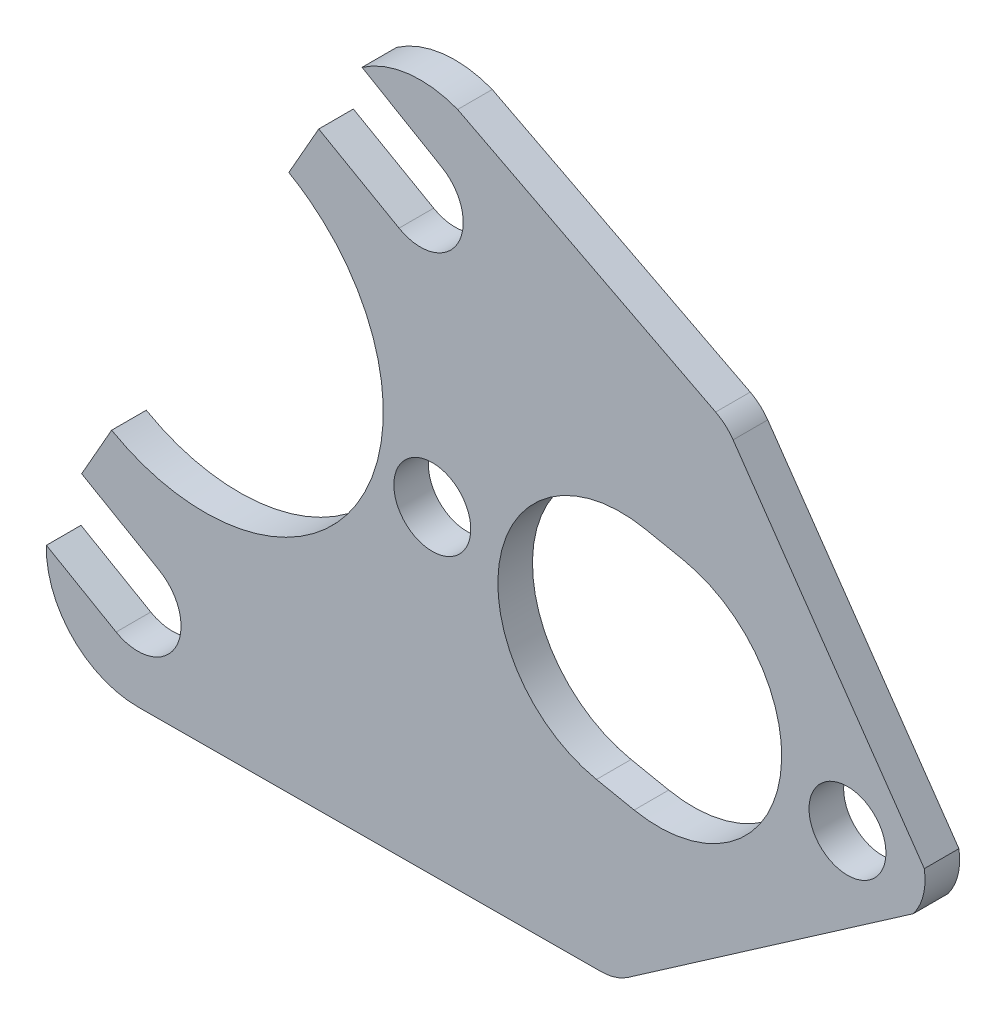
ISO-10303-21;
HEADER;
FILE_DESCRIPTION(('STEP AP214'),'2;1');
FILE_NAME('part.step','',(''),(''),'','','');
FILE_SCHEMA(('AUTOMOTIVE_DESIGN { 1 0 10303 214 1 1 1 1 }'));
ENDSEC;
DATA;
#1=APPLICATION_CONTEXT('core data for automotive mechanical design processes');
#2=APPLICATION_PROTOCOL_DEFINITION('international standard','automotive_design',2000,#1);
#3=PRODUCT_CONTEXT('',#1,'mechanical');
#4=PRODUCT('Part','Part','',(#3));
#5=PRODUCT_RELATED_PRODUCT_CATEGORY('part','',(#4));
#6=PRODUCT_DEFINITION_FORMATION('','',#4);
#7=PRODUCT_DEFINITION_CONTEXT('part definition',#1,'design');
#8=PRODUCT_DEFINITION('design','',#6,#7);
#9=PRODUCT_DEFINITION_SHAPE('','',#8);
#10=(LENGTH_UNIT() NAMED_UNIT(*) SI_UNIT(.MILLI.,.METRE.));
#11=(NAMED_UNIT(*) PLANE_ANGLE_UNIT() SI_UNIT($,.RADIAN.));
#12=(NAMED_UNIT(*) SI_UNIT($,.STERADIAN.) SOLID_ANGLE_UNIT());
#13=UNCERTAINTY_MEASURE_WITH_UNIT(LENGTH_MEASURE(1.E-05),#10,'distance_accuracy_value','');
#14=(GEOMETRIC_REPRESENTATION_CONTEXT(3) GLOBAL_UNCERTAINTY_ASSIGNED_CONTEXT((#13)) GLOBAL_UNIT_ASSIGNED_CONTEXT((#10,
#11,#12)) REPRESENTATION_CONTEXT('',''));
#15=CARTESIAN_POINT('',(0.,0.,0.));
#16=DIRECTION('',(0.,0.,1.));
#17=DIRECTION('',(1.,0.,0.));
#18=AXIS2_PLACEMENT_3D('',#15,#16,#17);
#19=CARTESIAN_POINT('',(66.2260905389,75.3633362444,3.6));
#20=DIRECTION('',(0.,0.,1.));
#21=DIRECTION('',(1.,0.,0.));
#22=AXIS2_PLACEMENT_3D('',#19,#20,#21);
#23=PLANE('',#22);
#24=CARTESIAN_POINT('',(90.3634607096014,68.9132261807579,3.6));
#25=DIRECTION('',(0.,0.,1.));
#26=DIRECTION('',(1.,0.,0.));
#27=AXIS2_PLACEMENT_3D('',#24,#25,#26);
#28=CIRCLE('',#27,4.00000000000001);
#29=CARTESIAN_POINT('',(94.3634607096014,68.9132261807579,3.6));
#30=VERTEX_POINT('',#29);
#31=EDGE_CURVE('E665',#30,#30,#28,.T.);
#32=ORIENTED_EDGE('',*,*,#31,.F.);
#33=EDGE_LOOP('',(#32));
#34=FACE_BOUND('',#33,.T.);
#35=CARTESIAN_POINT('',(133.545555928446,61.3323918502146,3.6));
#36=DIRECTION('',(0.,0.,1.));
#37=DIRECTION('',(1.,0.,0.));
#38=AXIS2_PLACEMENT_3D('',#35,#36,#37);
#39=CIRCLE('',#38,3.99999999999999);
#40=CARTESIAN_POINT('',(137.545555928446,61.3323918502146,3.6));
#41=VERTEX_POINT('',#40);
#42=EDGE_CURVE('E388',#41,#41,#39,.T.);
#43=ORIENTED_EDGE('',*,*,#42,.F.);
#44=EDGE_LOOP('',(#43));
#45=FACE_BOUND('',#44,.T.);
#46=CARTESIAN_POINT('',(109.981701342205,65.4540011230173,3.6));
#47=DIRECTION('',(0.,0.,1.));
#48=DIRECTION('',(1.,0.,0.));
#49=AXIS2_PLACEMENT_3D('',#46,#47,#48);
#50=CIRCLE('',#49,12.8);
#51=CARTESIAN_POINT('',(112.523140625589,77.9991629939887,3.6));
#52=VERTEX_POINT('',#51);
#53=CARTESIAN_POINT('',(107.440262058821,52.908839252046,3.6));
#54=VERTEX_POINT('',#53);
#55=EDGE_CURVE('E404',#52,#54,#50,.T.);
#56=ORIENTED_EDGE('',*,*,#55,.F.);
#57=DIRECTION('',(-0.980090771169636,0.198549944014369,0.));
#58=VECTOR('',#57,1.);
#59=CARTESIAN_POINT('',(19.6142968870189,96.8209356964479,3.6));
#60=LINE('',#59,#58);
#61=CARTESIAN_POINT('',(116.443503710267,77.2049632179312,3.6));
#62=VERTEX_POINT('',#61);
#63=EDGE_CURVE('E402',#62,#52,#60,.T.);
#64=ORIENTED_EDGE('',*,*,#63,.F.);
#65=CARTESIAN_POINT('',(113.902064426883,64.6598013469599,3.6));
#66=DIRECTION('',(0.,0.,1.));
#67=DIRECTION('',(1.,0.,0.));
#68=AXIS2_PLACEMENT_3D('',#65,#66,#67);
#69=CIRCLE('',#68,12.8);
#70=CARTESIAN_POINT('',(111.3606251435,52.1146394759885,3.6));
#71=VERTEX_POINT('',#70);
#72=EDGE_CURVE('E410',#71,#62,#69,.T.);
#73=ORIENTED_EDGE('',*,*,#72,.F.);
#74=DIRECTION('',(-0.980090771169636,0.198549944014369,0.));
#75=VECTOR('',#74,1.);
#76=CARTESIAN_POINT('',(14.5314183202511,71.7306119545052,3.6));
#77=LINE('',#76,#75);
#78=EDGE_CURVE('E407',#71,#54,#77,.T.);
#79=ORIENTED_EDGE('',*,*,#78,.T.);
#80=EDGE_LOOP('',(#56,#64,#73,#79));
#81=FACE_BOUND('',#80,.T.);
#82=DIRECTION('',(-0.821795837048083,-0.569782065539484,0.));
#83=VECTOR('',#82,1.);
#84=CARTESIAN_POINT('',(98.7669341966153,28.429725186244,3.6));
#85=LINE('',#84,#83);
#86=CARTESIAN_POINT('',(140.392665169184,57.2904152797051,3.6));
#87=VERTEX_POINT('',#86);
#88=CARTESIAN_POINT('',(110.734720016565,36.7274427177894,3.6));
#89=VERTEX_POINT('',#88);
#90=EDGE_CURVE('E393',#87,#89,#85,.T.);
#91=ORIENTED_EDGE('',*,*,#90,.F.);
#92=CARTESIAN_POINT('',(135.508803527145,60.952972268249,3.6));
#93=DIRECTION('',(0.,0.,1.));
#94=DIRECTION('',(1.,0.,0.));
#95=AXIS2_PLACEMENT_3D('',#92,#93,#94);
#96=CIRCLE('',#95,6.10462351279076);
#97=CARTESIAN_POINT('',(141.535727347608,61.9238571714403,3.6));
#98=VERTEX_POINT('',#97);
#99=EDGE_CURVE('E374',#87,#98,#96,.T.);
#100=ORIENTED_EDGE('',*,*,#99,.T.);
#101=DIRECTION('',(0.569782065539484,-0.821795837048083,0.));
#102=VECTOR('',#101,1.);
#103=CARTESIAN_POINT('',(124.581434059325,86.3770095029575,3.6));
#104=LINE('',#103,#102);
#105=CARTESIAN_POINT('',(121.651882961464,90.6022967526749,3.6));
#106=VERTEX_POINT('',#105);
#107=EDGE_CURVE('E378',#106,#98,#104,.T.);
#108=ORIENTED_EDGE('',*,*,#107,.F.);
#109=CARTESIAN_POINT('',(117.542903776224,87.7533864249775,3.6));
#110=DIRECTION('',(0.,0.,1.));
#111=DIRECTION('',(1.,0.,0.));
#112=AXIS2_PLACEMENT_3D('',#109,#110,#111);
#113=CIRCLE('',#112,5.);
#114=CARTESIAN_POINT('',(119.834613545866,92.1972660736322,3.6));
#115=VERTEX_POINT('',#114);
#116=EDGE_CURVE('E603',#106,#115,#113,.T.);
#117=ORIENTED_EDGE('',*,*,#116,.T.);
#118=DIRECTION('',(-0.888775929730931,0.458341953928417,0.));
#119=VECTOR('',#118,1.);
#120=CARTESIAN_POINT('',(62.7323198720739,121.64493221842,3.6));
#121=LINE('',#120,#119);
#122=CARTESIAN_POINT('',(92.9994998125568,106.0361404749,3.6));
#123=VERTEX_POINT('',#122);
#124=EDGE_CURVE('E400',#115,#123,#121,.T.);
#125=ORIENTED_EDGE('',*,*,#124,.T.);
#126=CARTESIAN_POINT('',(89.1295998537948,96.1540237001324,3.6));
#127=DIRECTION('',(0.,0.,1.));
#128=DIRECTION('',(1.,0.,0.));
#129=AXIS2_PLACEMENT_3D('',#126,#127,#128);
#130=CIRCLE('',#129,10.6128392827256);
#131=CARTESIAN_POINT('',(83.0608323656568,104.8604821544,3.6));
#132=VERTEX_POINT('',#131);
#133=EDGE_CURVE('E588',#123,#132,#130,.T.);
#134=ORIENTED_EDGE('',*,*,#133,.T.);
#135=DIRECTION('',(0.863225442370652,-0.504818616578263,0.));
#136=VECTOR('',#135,1.);
#137=CARTESIAN_POINT('',(83.0608323656568,104.8604821544,3.6));
#138=LINE('',#137,#136);
#139=CARTESIAN_POINT('',(91.3561306915568,100.0093496235,3.6));
#140=VERTEX_POINT('',#139);
#141=EDGE_CURVE('E615',#132,#140,#138,.T.);
#142=ORIENTED_EDGE('',*,*,#141,.T.);
#143=CARTESIAN_POINT('',(89.1300439095068,96.1537673169998,3.6));
#144=DIRECTION('',(0.,0.,1.));
#145=DIRECTION('',(1.,0.,0.));
#146=AXIS2_PLACEMENT_3D('',#143,#144,#145);
#147=CIRCLE('',#146,4.45207561519496);
#148=CARTESIAN_POINT('',(86.9039571274568,92.2981850104998,3.6));
#149=VERTEX_POINT('',#148);
#150=EDGE_CURVE('E617',#149,#140,#147,.T.);
#151=ORIENTED_EDGE('',*,*,#150,.F.);
#152=DIRECTION('',(0.868810396856309,-0.495144922537214,0.));
#153=VECTOR('',#152,1.);
#154=CARTESIAN_POINT('',(78.5551802845568,97.0562478491998,3.6));
#155=LINE('',#154,#153);
#156=CARTESIAN_POINT('',(78.5551802845568,97.0562478491998,3.6));
#157=VERTEX_POINT('',#156);
#158=EDGE_CURVE('E640',#157,#149,#155,.T.);
#159=ORIENTED_EDGE('',*,*,#158,.F.);
#160=DIRECTION('',(0.494117617130238,0.869395065802386,0.));
#161=VECTOR('',#160,1.);
#162=CARTESIAN_POINT('',(75.4400477996607,91.5752030173668,3.6));
#163=LINE('',#162,#161);
#164=CARTESIAN_POINT('',(75.4400477996607,91.5752030173668,3.6));
#165=VERTEX_POINT('',#164);
#166=EDGE_CURVE('E456',#165,#157,#163,.T.);
#167=ORIENTED_EDGE('',*,*,#166,.F.);
#168=CARTESIAN_POINT('',(66.2260905389,75.3633362444,3.6));
#169=DIRECTION('',(0.,0.,1.));
#170=DIRECTION('',(0.869395065803295,-0.494117617128639,0.));
#171=AXIS2_PLACEMENT_3D('',#168,#169,#170);
#172=ELLIPSE('',#171,19.1691381710503,18.6472955858899);
#173=CARTESIAN_POINT('',(57.0121332781069,59.1514694714516,3.6));
#174=VERTEX_POINT('',#173);
#175=EDGE_CURVE('E452',#174,#165,#172,.T.);
#176=ORIENTED_EDGE('',*,*,#175,.F.);
#177=DIRECTION('',(0.494117617130272,0.869395065802367,0.));
#178=VECTOR('',#177,1.);
#179=CARTESIAN_POINT('',(53.8970007932,53.6704246396,3.6));
#180=LINE('',#179,#178);
#181=CARTESIAN_POINT('',(53.8970007932,53.6704246396,3.6));
#182=VERTEX_POINT('',#181);
#183=EDGE_CURVE('E449',#182,#174,#180,.T.);
#184=ORIENTED_EDGE('',*,*,#183,.F.);
#185=DIRECTION('',(-0.865993027095381,0.500056073877899,0.));
#186=VECTOR('',#185,1.);
#187=CARTESIAN_POINT('',(61.9848103957,49.0002273175,3.6));
#188=LINE('',#187,#186);
#189=CARTESIAN_POINT('',(61.9848103957,49.0002273175,3.6));
#190=VERTEX_POINT('',#189);
#191=EDGE_CURVE('E446',#190,#182,#188,.T.);
#192=ORIENTED_EDGE('',*,*,#191,.F.);
#193=CARTESIAN_POINT('',(59.73290559445,45.10432597855,3.6));
#194=DIRECTION('',(0.,0.,1.));
#195=DIRECTION('',(1.,0.,0.));
#196=AXIS2_PLACEMENT_3D('',#193,#194,#195);
#197=CIRCLE('',#196,4.49990249635758);
#198=CARTESIAN_POINT('',(57.4810007932,41.2084246396,3.6));
#199=VERTEX_POINT('',#198);
#200=EDGE_CURVE('E443',#199,#190,#197,.T.);
#201=ORIENTED_EDGE('',*,*,#200,.F.);
#202=DIRECTION('',(0.866028909405279,-0.499993928037435,0.));
#203=VECTOR('',#202,1.);
#204=CARTESIAN_POINT('',(50.2285358717,45.3955694158,3.6));
#205=LINE('',#204,#203);
#206=CARTESIAN_POINT('',(50.2285358717,45.3955694158,3.6));
#207=VERTEX_POINT('',#206);
#208=EDGE_CURVE('E440',#207,#199,#205,.T.);
#209=ORIENTED_EDGE('',*,*,#208,.F.);
#210=CARTESIAN_POINT('',(59.7347823866165,45.103647176955,3.6));
#211=DIRECTION('',(0.,0.,1.));
#212=DIRECTION('',(1.,0.,0.));
#213=AXIS2_PLACEMENT_3D('',#210,#211,#212);
#214=CIRCLE('',#213,9.51072770064907);
#215=CARTESIAN_POINT('',(59.7828894487,35.5930411444,3.6));
#216=VERTEX_POINT('',#215);
#217=EDGE_CURVE('E436',#207,#216,#214,.T.);
#218=ORIENTED_EDGE('',*,*,#217,.T.);
#219=DIRECTION('',(0.999987207278143,0.00505818940525294,0.));
#220=VECTOR('',#219,1.);
#221=CARTESIAN_POINT('',(107.879099237603,35.8363239954365,3.6));
#222=LINE('',#221,#220);
#223=CARTESIAN_POINT('',(107.911100635893,35.836485866641,3.6));
#224=VERTEX_POINT('',#223);
#225=EDGE_CURVE('E433',#216,#224,#222,.T.);
#226=ORIENTED_EDGE('',*,*,#225,.T.);
#227=CARTESIAN_POINT('',(107.885809688867,40.8364219030298,3.6));
#228=DIRECTION('',(0.,0.,1.));
#229=DIRECTION('',(1.,0.,0.));
#230=AXIS2_PLACEMENT_3D('',#227,#228,#229);
#231=CIRCLE('',#230,5.);
#232=EDGE_CURVE('E653',#224,#89,#231,.T.);
#233=ORIENTED_EDGE('',*,*,#232,.T.);
#234=EDGE_LOOP('',(#91,#100,#108,#117,#125,#134,#142,#151,#159,#167,#176,#184,#192,#201,#209,
#218,#226,#233));
#235=FACE_BOUND('',#234,.T.);
#236=ADVANCED_FACE('F224',(#34,#45,#81,#235),#23,.T.);
#237=CARTESIAN_POINT('',(66.2260905389,75.3633362444,0.));
#238=DIRECTION('',(0.,0.,1.));
#239=DIRECTION('',(1.,0.,0.));
#240=AXIS2_PLACEMENT_3D('',#237,#238,#239);
#241=PLANE('',#240);
#242=CARTESIAN_POINT('',(90.3634607096014,68.9132261807579,0.));
#243=DIRECTION('',(0.,0.,-1.));
#244=DIRECTION('',(-1.,0.,0.));
#245=AXIS2_PLACEMENT_3D('',#242,#243,#244);
#246=CIRCLE('',#245,4.00000000000001);
#247=CARTESIAN_POINT('',(86.3634607096014,68.9132261807579,0.));
#248=VERTEX_POINT('',#247);
#249=EDGE_CURVE('E668',#248,#248,#246,.T.);
#250=ORIENTED_EDGE('',*,*,#249,.F.);
#251=EDGE_LOOP('',(#250));
#252=FACE_BOUND('',#251,.T.);
#253=CARTESIAN_POINT('',(133.545555928446,61.3323918502146,0.));
#254=DIRECTION('',(0.,0.,-1.));
#255=DIRECTION('',(-1.,0.,0.));
#256=AXIS2_PLACEMENT_3D('',#253,#254,#255);
#257=CIRCLE('',#256,3.99999999999999);
#258=CARTESIAN_POINT('',(129.545555928446,61.3323918502146,0.));
#259=VERTEX_POINT('',#258);
#260=EDGE_CURVE('E662',#259,#259,#257,.T.);
#261=ORIENTED_EDGE('',*,*,#260,.F.);
#262=EDGE_LOOP('',(#261));
#263=FACE_BOUND('',#262,.T.);
#264=DIRECTION('',(-0.980090771169636,0.198549944014369,0.));
#265=VECTOR('',#264,1.);
#266=CARTESIAN_POINT('',(19.6142968870189,96.8209356964479,0.));
#267=LINE('',#266,#265);
#268=CARTESIAN_POINT('',(116.443503710267,77.2049632179312,0.));
#269=VERTEX_POINT('',#268);
#270=CARTESIAN_POINT('',(112.523140625589,77.9991629939887,0.));
#271=VERTEX_POINT('',#270);
#272=EDGE_CURVE('E396',#269,#271,#267,.T.);
#273=ORIENTED_EDGE('',*,*,#272,.T.);
#274=CARTESIAN_POINT('',(109.981701342205,65.4540011230173,0.));
#275=DIRECTION('',(0.,0.,1.));
#276=DIRECTION('',(1.,0.,0.));
#277=AXIS2_PLACEMENT_3D('',#274,#275,#276);
#278=CIRCLE('',#277,12.8);
#279=CARTESIAN_POINT('',(107.440262058821,52.908839252046,0.));
#280=VERTEX_POINT('',#279);
#281=EDGE_CURVE('E415',#271,#280,#278,.T.);
#282=ORIENTED_EDGE('',*,*,#281,.T.);
#283=DIRECTION('',(-0.980090771169636,0.198549944014369,0.));
#284=VECTOR('',#283,1.);
#285=CARTESIAN_POINT('',(14.5314183202511,71.7306119545052,0.));
#286=LINE('',#285,#284);
#287=CARTESIAN_POINT('',(111.3606251435,52.1146394759885,0.));
#288=VERTEX_POINT('',#287);
#289=EDGE_CURVE('E418',#288,#280,#286,.T.);
#290=ORIENTED_EDGE('',*,*,#289,.F.);
#291=CARTESIAN_POINT('',(113.902064426883,64.6598013469599,0.));
#292=DIRECTION('',(0.,0.,1.));
#293=DIRECTION('',(1.,0.,0.));
#294=AXIS2_PLACEMENT_3D('',#291,#292,#293);
#295=CIRCLE('',#294,12.8);
#296=EDGE_CURVE('E405',#288,#269,#295,.T.);
#297=ORIENTED_EDGE('',*,*,#296,.T.);
#298=EDGE_LOOP('',(#273,#282,#290,#297));
#299=FACE_BOUND('',#298,.T.);
#300=CARTESIAN_POINT('',(135.508803527145,60.952972268249,0.));
#301=DIRECTION('',(0.,0.,-1.));
#302=DIRECTION('',(-1.,0.,0.));
#303=AXIS2_PLACEMENT_3D('',#300,#301,#302);
#304=CIRCLE('',#303,6.10462351279076);
#305=CARTESIAN_POINT('',(141.535727347608,61.9238571714403,0.));
#306=VERTEX_POINT('',#305);
#307=CARTESIAN_POINT('',(140.392665169184,57.2904152797051,0.));
#308=VERTEX_POINT('',#307);
#309=EDGE_CURVE('E238',#306,#308,#304,.T.);
#310=ORIENTED_EDGE('',*,*,#309,.T.);
#311=DIRECTION('',(0.821795837048083,0.569782065539484,0.));
#312=VECTOR('',#311,1.);
#313=CARTESIAN_POINT('',(140.868549555466,57.6203638829345,0.));
#314=LINE('',#313,#312);
#315=CARTESIAN_POINT('',(110.734720016565,36.7274427177894,0.));
#316=VERTEX_POINT('',#315);
#317=EDGE_CURVE('E384',#316,#308,#314,.T.);
#318=ORIENTED_EDGE('',*,*,#317,.F.);
#319=CARTESIAN_POINT('',(107.885809688867,40.8364219030298,0.));
#320=DIRECTION('',(0.,0.,1.));
#321=DIRECTION('',(1.,0.,0.));
#322=AXIS2_PLACEMENT_3D('',#319,#320,#321);
#323=CIRCLE('',#322,5.);
#324=CARTESIAN_POINT('',(107.911100635893,35.8364858666391,0.));
#325=VERTEX_POINT('',#324);
#326=EDGE_CURVE('E597',#316,#325,#323,.F.);
#327=ORIENTED_EDGE('',*,*,#326,.T.);
#328=DIRECTION('',(0.999987207278144,0.00505818940520393,0.));
#329=VECTOR('',#328,1.);
#330=CARTESIAN_POINT('',(59.7828894487,35.5930411444,0.));
#331=LINE('',#330,#329);
#332=CARTESIAN_POINT('',(59.7828894487,35.5930411444,0.));
#333=VERTEX_POINT('',#332);
#334=EDGE_CURVE('E432',#333,#325,#331,.T.);
#335=ORIENTED_EDGE('',*,*,#334,.F.);
#336=CARTESIAN_POINT('',(59.7347823866165,45.103647176955,0.));
#337=DIRECTION('',(0.,0.,1.));
#338=DIRECTION('',(1.,0.,0.));
#339=AXIS2_PLACEMENT_3D('',#336,#337,#338);
#340=CIRCLE('',#339,9.51072770064907);
#341=CARTESIAN_POINT('',(50.2285358717,45.3955694158,0.));
#342=VERTEX_POINT('',#341);
#343=EDGE_CURVE('E623',#342,#333,#340,.T.);
#344=ORIENTED_EDGE('',*,*,#343,.F.);
#345=DIRECTION('',(0.866028909405279,-0.499993928037435,0.));
#346=VECTOR('',#345,1.);
#347=CARTESIAN_POINT('',(50.2285358717,45.3955694158,0.));
#348=LINE('',#347,#346);
#349=CARTESIAN_POINT('',(57.4810007932,41.2084246396,0.));
#350=VERTEX_POINT('',#349);
#351=EDGE_CURVE('E625',#342,#350,#348,.T.);
#352=ORIENTED_EDGE('',*,*,#351,.T.);
#353=CARTESIAN_POINT('',(59.73290559445,45.10432597855,0.));
#354=DIRECTION('',(0.,0.,1.));
#355=DIRECTION('',(1.,0.,0.));
#356=AXIS2_PLACEMENT_3D('',#353,#354,#355);
#357=CIRCLE('',#356,4.49990249635758);
#358=CARTESIAN_POINT('',(61.9848103957,49.0002273175,0.));
#359=VERTEX_POINT('',#358);
#360=EDGE_CURVE('E628',#350,#359,#357,.T.);
#361=ORIENTED_EDGE('',*,*,#360,.T.);
#362=DIRECTION('',(-0.865993027095381,0.500056073877899,0.));
#363=VECTOR('',#362,1.);
#364=CARTESIAN_POINT('',(61.9848103957,49.0002273175,0.));
#365=LINE('',#364,#363);
#366=CARTESIAN_POINT('',(53.8970007932,53.6704246396,0.));
#367=VERTEX_POINT('',#366);
#368=EDGE_CURVE('E631',#359,#367,#365,.T.);
#369=ORIENTED_EDGE('',*,*,#368,.T.);
#370=DIRECTION('',(0.494117617130272,0.869395065802367,0.));
#371=VECTOR('',#370,1.);
#372=CARTESIAN_POINT('',(53.8970007932,53.6704246396,0.));
#373=LINE('',#372,#371);
#374=CARTESIAN_POINT('',(57.0121332781069,59.1514694714516,0.));
#375=VERTEX_POINT('',#374);
#376=EDGE_CURVE('E553',#367,#375,#373,.T.);
#377=ORIENTED_EDGE('',*,*,#376,.T.);
#378=CARTESIAN_POINT('',(66.2260905389,75.3633362444,0.));
#379=DIRECTION('',(0.,0.,1.));
#380=DIRECTION('',(0.869395065803295,-0.494117617128639,0.));
#381=AXIS2_PLACEMENT_3D('',#378,#379,#380);
#382=ELLIPSE('',#381,19.1691381710503,18.6472955858899);
#383=CARTESIAN_POINT('',(75.4400477996607,91.5752030173668,0.));
#384=VERTEX_POINT('',#383);
#385=EDGE_CURVE('E551',#375,#384,#382,.T.);
#386=ORIENTED_EDGE('',*,*,#385,.T.);
#387=DIRECTION('',(0.494117617130238,0.869395065802386,0.));
#388=VECTOR('',#387,1.);
#389=CARTESIAN_POINT('',(75.4400477996607,91.5752030173668,0.));
#390=LINE('',#389,#388);
#391=CARTESIAN_POINT('',(78.5551802845568,97.0562478491998,0.));
#392=VERTEX_POINT('',#391);
#393=EDGE_CURVE('E545',#384,#392,#390,.T.);
#394=ORIENTED_EDGE('',*,*,#393,.T.);
#395=DIRECTION('',(0.868810396856309,-0.495144922537214,0.));
#396=VECTOR('',#395,1.);
#397=CARTESIAN_POINT('',(78.5551802845568,97.0562478491998,0.));
#398=LINE('',#397,#396);
#399=CARTESIAN_POINT('',(86.9039571274568,92.2981850104998,0.));
#400=VERTEX_POINT('',#399);
#401=EDGE_CURVE('E536',#392,#400,#398,.T.);
#402=ORIENTED_EDGE('',*,*,#401,.T.);
#403=CARTESIAN_POINT('',(89.1300439095068,96.1537673169998,0.));
#404=DIRECTION('',(0.,0.,1.));
#405=DIRECTION('',(1.,0.,0.));
#406=AXIS2_PLACEMENT_3D('',#403,#404,#405);
#407=CIRCLE('',#406,4.45207561519496);
#408=CARTESIAN_POINT('',(91.3561306915568,100.0093496235,0.));
#409=VERTEX_POINT('',#408);
#410=EDGE_CURVE('E544',#400,#409,#407,.T.);
#411=ORIENTED_EDGE('',*,*,#410,.T.);
#412=DIRECTION('',(0.863225442370652,-0.504818616578263,0.));
#413=VECTOR('',#412,1.);
#414=CARTESIAN_POINT('',(83.0608323656568,104.8604821544,0.));
#415=LINE('',#414,#413);
#416=CARTESIAN_POINT('',(83.0608323656568,104.8604821544,0.));
#417=VERTEX_POINT('',#416);
#418=EDGE_CURVE('E558',#417,#409,#415,.T.);
#419=ORIENTED_EDGE('',*,*,#418,.F.);
#420=CARTESIAN_POINT('',(89.1295998537948,96.1540237001324,0.));
#421=DIRECTION('',(0.,0.,1.));
#422=DIRECTION('',(1.,0.,0.));
#423=AXIS2_PLACEMENT_3D('',#420,#421,#422);
#424=CIRCLE('',#423,10.6128392827256);
#425=CARTESIAN_POINT('',(92.9994998125568,106.0361404749,0.));
#426=VERTEX_POINT('',#425);
#427=EDGE_CURVE('E437',#426,#417,#424,.T.);
#428=ORIENTED_EDGE('',*,*,#427,.F.);
#429=DIRECTION('',(-0.888775929730931,0.458341953928417,0.));
#430=VECTOR('',#429,1.);
#431=CARTESIAN_POINT('',(62.7323198720739,121.64493221842,0.));
#432=LINE('',#431,#430);
#433=CARTESIAN_POINT('',(119.834613545866,92.1972660736322,0.));
#434=VERTEX_POINT('',#433);
#435=EDGE_CURVE('E394',#434,#426,#432,.T.);
#436=ORIENTED_EDGE('',*,*,#435,.F.);
#437=CARTESIAN_POINT('',(117.542903776224,87.7533864249775,0.));
#438=DIRECTION('',(0.,0.,1.));
#439=DIRECTION('',(1.,0.,0.));
#440=AXIS2_PLACEMENT_3D('',#437,#438,#439);
#441=CIRCLE('',#440,5.);
#442=CARTESIAN_POINT('',(121.651882961464,90.6022967526749,0.));
#443=VERTEX_POINT('',#442);
#444=EDGE_CURVE('E232',#434,#443,#441,.F.);
#445=ORIENTED_EDGE('',*,*,#444,.T.);
#446=DIRECTION('',(0.569782065539484,-0.821795837048083,0.));
#447=VECTOR('',#446,1.);
#448=CARTESIAN_POINT('',(124.581434059325,86.3770095029575,0.));
#449=LINE('',#448,#447);
#450=EDGE_CURVE('E387',#443,#306,#449,.T.);
#451=ORIENTED_EDGE('',*,*,#450,.T.);
#452=EDGE_LOOP('',(#310,#318,#327,#335,#344,#352,#361,#369,#377,#386,#394,#402,#411,#419,#428,
#436,#445,#451));
#453=FACE_BOUND('',#452,.T.);
#454=ADVANCED_FACE('F383',(#252,#263,#299,#453),#241,.F.);
#455=CARTESIAN_POINT('',(140.868549555466,57.6203638829345,10.));
#456=DIRECTION('',(-0.569782065539484,0.821795837048083,0.));
#457=DIRECTION('',(-0.821795837048083,-0.569782065539484,0.));
#458=AXIS2_PLACEMENT_3D('',#455,#456,#457);
#459=PLANE('',#458);
#460=DIRECTION('',(0.,0.,-1.));
#461=VECTOR('',#460,1.);
#462=CARTESIAN_POINT('',(140.392665169184,57.2904152797051,10.));
#463=LINE('',#462,#461);
#464=EDGE_CURVE('E371',#87,#308,#463,.T.);
#465=ORIENTED_EDGE('',*,*,#464,.F.);
#466=ORIENTED_EDGE('',*,*,#90,.T.);
#467=DIRECTION('',(0.,0.,1.));
#468=VECTOR('',#467,1.);
#469=CARTESIAN_POINT('',(110.734720016565,36.7274427177894,10.));
#470=LINE('',#469,#468);
#471=EDGE_CURVE('E392',#89,#316,#470,.F.);
#472=ORIENTED_EDGE('',*,*,#471,.T.);
#473=ORIENTED_EDGE('',*,*,#317,.T.);
#474=EDGE_LOOP('',(#465,#466,#472,#473));
#475=FACE_BOUND('',#474,.T.);
#476=ADVANCED_FACE('F390',(#475),#459,.F.);
#477=CARTESIAN_POINT('',(124.581434059325,86.3770095029575,0.));
#478=DIRECTION('',(-0.821795837048083,-0.569782065539484,0.));
#479=DIRECTION('',(0.569782065539484,-0.821795837048083,0.));
#480=AXIS2_PLACEMENT_3D('',#477,#478,#479);
#481=PLANE('',#480);
#482=DIRECTION('',(0.,0.,-1.));
#483=VECTOR('',#482,1.);
#484=CARTESIAN_POINT('',(141.535727347608,61.9238571714403,10.));
#485=LINE('',#484,#483);
#486=EDGE_CURVE('E12',#306,#98,#485,.F.);
#487=ORIENTED_EDGE('',*,*,#486,.F.);
#488=ORIENTED_EDGE('',*,*,#450,.F.);
#489=DIRECTION('',(0.,0.,1.));
#490=VECTOR('',#489,1.);
#491=CARTESIAN_POINT('',(121.651882961464,90.6022967526749,3.6));
#492=LINE('',#491,#490);
#493=EDGE_CURVE('E600',#443,#106,#492,.T.);
#494=ORIENTED_EDGE('',*,*,#493,.T.);
#495=ORIENTED_EDGE('',*,*,#107,.T.);
#496=EDGE_LOOP('',(#487,#488,#494,#495));
#497=FACE_BOUND('',#496,.T.);
#498=ADVANCED_FACE('F519',(#497),#481,.F.);
#499=CARTESIAN_POINT('',(89.1295998537948,96.1540237001324,3.6));
#500=DIRECTION('',(0.,0.,-1.));
#501=DIRECTION('',(-1.,0.,0.));
#502=AXIS2_PLACEMENT_3D('',#499,#500,#501);
#503=CYLINDRICAL_SURFACE('',#502,10.6128392827256);
#504=ORIENTED_EDGE('',*,*,#427,.T.);
#505=DIRECTION('',(0.,0.,-1.));
#506=VECTOR('',#505,1.);
#507=CARTESIAN_POINT('',(83.0608323656568,104.8604821544,3.6));
#508=LINE('',#507,#506);
#509=EDGE_CURVE('E566',#132,#417,#508,.T.);
#510=ORIENTED_EDGE('',*,*,#509,.F.);
#511=ORIENTED_EDGE('',*,*,#133,.F.);
#512=DIRECTION('',(0.,0.,-1.));
#513=VECTOR('',#512,1.);
#514=CARTESIAN_POINT('',(92.9994998125568,106.0361404749,3.6));
#515=LINE('',#514,#513);
#516=EDGE_CURVE('E562',#123,#426,#515,.T.);
#517=ORIENTED_EDGE('',*,*,#516,.T.);
#518=EDGE_LOOP('',(#504,#510,#511,#517));
#519=FACE_BOUND('',#518,.T.);
#520=ADVANCED_FACE('F515',(#519),#503,.T.);
#521=CARTESIAN_POINT('',(83.0608323656568,104.8604821544,3.6));
#522=DIRECTION('',(0.504818616578263,0.863225442370652,0.));
#523=DIRECTION('',(-0.863225442370652,0.504818616578263,0.));
#524=AXIS2_PLACEMENT_3D('',#521,#522,#523);
#525=PLANE('',#524);
#526=ORIENTED_EDGE('',*,*,#418,.T.);
#527=DIRECTION('',(0.,0.,-1.));
#528=VECTOR('',#527,1.);
#529=CARTESIAN_POINT('',(91.3561306915568,100.0093496235,3.6));
#530=LINE('',#529,#528);
#531=EDGE_CURVE('E569',#140,#409,#530,.T.);
#532=ORIENTED_EDGE('',*,*,#531,.F.);
#533=ORIENTED_EDGE('',*,*,#141,.F.);
#534=ORIENTED_EDGE('',*,*,#509,.T.);
#535=EDGE_LOOP('',(#526,#532,#533,#534));
#536=FACE_BOUND('',#535,.T.);
#537=ADVANCED_FACE('F518',(#536),#525,.F.);
#538=CARTESIAN_POINT('',(89.1300439095068,96.1537673169998,3.6));
#539=DIRECTION('',(0.,0.,-1.));
#540=DIRECTION('',(-1.,0.,0.));
#541=AXIS2_PLACEMENT_3D('',#538,#539,#540);
#542=CYLINDRICAL_SURFACE('',#541,4.45207561519496);
#543=ORIENTED_EDGE('',*,*,#410,.F.);
#544=DIRECTION('',(0.,0.,-1.));
#545=VECTOR('',#544,1.);
#546=CARTESIAN_POINT('',(86.9039571274568,92.2981850104998,3.6));
#547=LINE('',#546,#545);
#548=EDGE_CURVE('E541',#149,#400,#547,.T.);
#549=ORIENTED_EDGE('',*,*,#548,.F.);
#550=ORIENTED_EDGE('',*,*,#150,.T.);
#551=ORIENTED_EDGE('',*,*,#531,.T.);
#552=EDGE_LOOP('',(#543,#549,#550,#551));
#553=FACE_BOUND('',#552,.T.);
#554=ADVANCED_FACE('F523',(#553),#542,.F.);
#555=CARTESIAN_POINT('',(78.5551802845568,97.0562478491998,3.6));
#556=DIRECTION('',(0.495144922537214,0.868810396856309,0.));
#557=DIRECTION('',(-0.868810396856309,0.495144922537214,0.));
#558=AXIS2_PLACEMENT_3D('',#555,#556,#557);
#559=PLANE('',#558);
#560=ORIENTED_EDGE('',*,*,#401,.F.);
#561=DIRECTION('',(0.,0.,-1.));
#562=VECTOR('',#561,1.);
#563=CARTESIAN_POINT('',(78.5551802845568,97.0562478491998,3.6));
#564=LINE('',#563,#562);
#565=EDGE_CURVE('E539',#157,#392,#564,.T.);
#566=ORIENTED_EDGE('',*,*,#565,.F.);
#567=ORIENTED_EDGE('',*,*,#158,.T.);
#568=ORIENTED_EDGE('',*,*,#548,.T.);
#569=EDGE_LOOP('',(#560,#566,#567,#568));
#570=FACE_BOUND('',#569,.T.);
#571=ADVANCED_FACE('F526',(#570),#559,.T.);
#572=CARTESIAN_POINT('',(75.4400477996607,91.5752030173668,3.6));
#573=DIRECTION('',(-0.869395065802386,0.494117617130238,0.));
#574=DIRECTION('',(-0.494117617130238,-0.869395065802386,0.));
#575=AXIS2_PLACEMENT_3D('',#572,#573,#574);
#576=PLANE('',#575);
#577=ORIENTED_EDGE('',*,*,#393,.F.);
#578=DIRECTION('',(0.,0.,-1.));
#579=VECTOR('',#578,1.);
#580=CARTESIAN_POINT('',(75.4400477996607,91.5752030173668,3.6));
#581=LINE('',#580,#579);
#582=EDGE_CURVE('E573',#165,#384,#581,.T.);
#583=ORIENTED_EDGE('',*,*,#582,.F.);
#584=ORIENTED_EDGE('',*,*,#166,.T.);
#585=ORIENTED_EDGE('',*,*,#565,.T.);
#586=EDGE_LOOP('',(#577,#583,#584,#585));
#587=FACE_BOUND('',#586,.T.);
#588=ADVANCED_FACE('F464',(#587),#576,.T.);
#589=DIRECTION('',(0.,0.,-1.));
#590=VECTOR('',#589,1.);
#591=SURFACE_OF_LINEAR_EXTRUSION('',#172,#590);
#592=ORIENTED_EDGE('',*,*,#385,.F.);
#593=DIRECTION('',(0.,0.,-1.));
#594=VECTOR('',#593,1.);
#595=CARTESIAN_POINT('',(57.0121332781069,59.1514694714516,3.6));
#596=LINE('',#595,#594);
#597=EDGE_CURVE('E575',#174,#375,#596,.T.);
#598=ORIENTED_EDGE('',*,*,#597,.F.);
#599=ORIENTED_EDGE('',*,*,#175,.T.);
#600=ORIENTED_EDGE('',*,*,#582,.T.);
#601=EDGE_LOOP('',(#592,#598,#599,#600));
#602=FACE_BOUND('',#601,.T.);
#603=ADVANCED_FACE('F459',(#602),#591,.T.);
#604=CARTESIAN_POINT('',(53.8970007932,53.6704246396,3.6));
#605=DIRECTION('',(-0.869395065802367,0.494117617130272,0.));
#606=DIRECTION('',(-0.494117617130272,-0.869395065802367,0.));
#607=AXIS2_PLACEMENT_3D('',#604,#605,#606);
#608=PLANE('',#607);
#609=ORIENTED_EDGE('',*,*,#376,.F.);
#610=DIRECTION('',(0.,0.,-1.));
#611=VECTOR('',#610,1.);
#612=CARTESIAN_POINT('',(53.8970007932,53.6704246396,3.6));
#613=LINE('',#612,#611);
#614=EDGE_CURVE('E577',#182,#367,#613,.T.);
#615=ORIENTED_EDGE('',*,*,#614,.F.);
#616=ORIENTED_EDGE('',*,*,#183,.T.);
#617=ORIENTED_EDGE('',*,*,#597,.T.);
#618=EDGE_LOOP('',(#609,#615,#616,#617));
#619=FACE_BOUND('',#618,.T.);
#620=ADVANCED_FACE('F463',(#619),#608,.T.);
#621=CARTESIAN_POINT('',(61.9848103957,49.0002273175,3.6));
#622=DIRECTION('',(-0.500056073877899,-0.865993027095381,0.));
#623=DIRECTION('',(0.865993027095381,-0.500056073877899,0.));
#624=AXIS2_PLACEMENT_3D('',#621,#622,#623);
#625=PLANE('',#624);
#626=ORIENTED_EDGE('',*,*,#368,.F.);
#627=DIRECTION('',(0.,0.,-1.));
#628=VECTOR('',#627,1.);
#629=CARTESIAN_POINT('',(61.9848103957,49.0002273175,3.6));
#630=LINE('',#629,#628);
#631=EDGE_CURVE('E579',#190,#359,#630,.T.);
#632=ORIENTED_EDGE('',*,*,#631,.F.);
#633=ORIENTED_EDGE('',*,*,#191,.T.);
#634=ORIENTED_EDGE('',*,*,#614,.T.);
#635=EDGE_LOOP('',(#626,#632,#633,#634));
#636=FACE_BOUND('',#635,.T.);
#637=ADVANCED_FACE('F469',(#636),#625,.T.);
#638=CARTESIAN_POINT('',(59.73290559445,45.10432597855,3.6));
#639=DIRECTION('',(0.,0.,-1.));
#640=DIRECTION('',(-1.,0.,0.));
#641=AXIS2_PLACEMENT_3D('',#638,#639,#640);
#642=CYLINDRICAL_SURFACE('',#641,4.49990249635758);
#643=ORIENTED_EDGE('',*,*,#360,.F.);
#644=DIRECTION('',(0.,0.,-1.));
#645=VECTOR('',#644,1.);
#646=CARTESIAN_POINT('',(57.4810007932,41.2084246396,3.6));
#647=LINE('',#646,#645);
#648=EDGE_CURVE('E581',#199,#350,#647,.T.);
#649=ORIENTED_EDGE('',*,*,#648,.F.);
#650=ORIENTED_EDGE('',*,*,#200,.T.);
#651=ORIENTED_EDGE('',*,*,#631,.T.);
#652=EDGE_LOOP('',(#643,#649,#650,#651));
#653=FACE_BOUND('',#652,.T.);
#654=ADVANCED_FACE('F473',(#653),#642,.F.);
#655=CARTESIAN_POINT('',(50.2285358717,45.3955694158,3.6));
#656=DIRECTION('',(0.499993928037435,0.866028909405279,0.));
#657=DIRECTION('',(-0.866028909405279,0.499993928037435,0.));
#658=AXIS2_PLACEMENT_3D('',#655,#656,#657);
#659=PLANE('',#658);
#660=ORIENTED_EDGE('',*,*,#351,.F.);
#661=DIRECTION('',(0.,0.,-1.));
#662=VECTOR('',#661,1.);
#663=CARTESIAN_POINT('',(50.2285358717,45.3955694158,3.6));
#664=LINE('',#663,#662);
#665=EDGE_CURVE('E583',#207,#342,#664,.T.);
#666=ORIENTED_EDGE('',*,*,#665,.F.);
#667=ORIENTED_EDGE('',*,*,#208,.T.);
#668=ORIENTED_EDGE('',*,*,#648,.T.);
#669=EDGE_LOOP('',(#660,#666,#667,#668));
#670=FACE_BOUND('',#669,.T.);
#671=ADVANCED_FACE('F477',(#670),#659,.T.);
#672=CARTESIAN_POINT('',(59.7347823866165,45.103647176955,3.6));
#673=DIRECTION('',(0.,0.,-1.));
#674=DIRECTION('',(-1.,0.,0.));
#675=AXIS2_PLACEMENT_3D('',#672,#673,#674);
#676=CYLINDRICAL_SURFACE('',#675,9.51072770064907);
#677=ORIENTED_EDGE('',*,*,#343,.T.);
#678=DIRECTION('',(0.,0.,-1.));
#679=VECTOR('',#678,1.);
#680=CARTESIAN_POINT('',(59.7828894487,35.5930411444,3.6));
#681=LINE('',#680,#679);
#682=EDGE_CURVE('E585',#216,#333,#681,.T.);
#683=ORIENTED_EDGE('',*,*,#682,.F.);
#684=ORIENTED_EDGE('',*,*,#217,.F.);
#685=ORIENTED_EDGE('',*,*,#665,.T.);
#686=EDGE_LOOP('',(#677,#683,#684,#685));
#687=FACE_BOUND('',#686,.T.);
#688=ADVANCED_FACE('F481',(#687),#676,.T.);
#689=CARTESIAN_POINT('',(59.7828894487,35.5930411444,3.6));
#690=DIRECTION('',(-0.00505818940520393,0.999987207278143,0.));
#691=DIRECTION('',(-0.999987207278144,-0.00505818940520393,0.));
#692=AXIS2_PLACEMENT_3D('',#689,#690,#691);
#693=PLANE('',#692);
#694=ORIENTED_EDGE('',*,*,#334,.T.);
#695=DIRECTION('',(0.,0.,1.));
#696=VECTOR('',#695,1.);
#697=CARTESIAN_POINT('',(107.911100635893,35.8364858666391,3.6));
#698=LINE('',#697,#696);
#699=EDGE_CURVE('E565',#325,#224,#698,.T.);
#700=ORIENTED_EDGE('',*,*,#699,.T.);
#701=ORIENTED_EDGE('',*,*,#225,.F.);
#702=ORIENTED_EDGE('',*,*,#682,.T.);
#703=EDGE_LOOP('',(#694,#700,#701,#702));
#704=FACE_BOUND('',#703,.T.);
#705=ADVANCED_FACE('F485',(#704),#693,.F.);
#706=CARTESIAN_POINT('',(19.6142968870189,96.8209356964479,3.6));
#707=DIRECTION('',(-0.198549944014369,-0.980090771169636,0.));
#708=DIRECTION('',(0.980090771169636,-0.198549944014369,0.));
#709=AXIS2_PLACEMENT_3D('',#706,#707,#708);
#710=PLANE('',#709);
#711=ORIENTED_EDGE('',*,*,#272,.F.);
#712=DIRECTION('',(0.,0.,-1.));
#713=VECTOR('',#712,1.);
#714=CARTESIAN_POINT('',(116.443503710267,77.2049632179312,3.6));
#715=LINE('',#714,#713);
#716=EDGE_CURVE('E412',#62,#269,#715,.T.);
#717=ORIENTED_EDGE('',*,*,#716,.F.);
#718=ORIENTED_EDGE('',*,*,#63,.T.);
#719=DIRECTION('',(0.,0.,-1.));
#720=VECTOR('',#719,1.);
#721=CARTESIAN_POINT('',(112.523140625589,77.9991629939887,3.6));
#722=LINE('',#721,#720);
#723=EDGE_CURVE('E429',#52,#271,#722,.T.);
#724=ORIENTED_EDGE('',*,*,#723,.T.);
#725=EDGE_LOOP('',(#711,#717,#718,#724));
#726=FACE_BOUND('',#725,.T.);
#727=ADVANCED_FACE('F488',(#726),#710,.T.);
#728=CARTESIAN_POINT('',(109.981701342205,65.4540011230173,3.6));
#729=DIRECTION('',(0.,0.,-1.));
#730=DIRECTION('',(-1.,0.,0.));
#731=AXIS2_PLACEMENT_3D('',#728,#729,#730);
#732=CYLINDRICAL_SURFACE('',#731,12.8);
#733=ORIENTED_EDGE('',*,*,#281,.F.);
#734=ORIENTED_EDGE('',*,*,#723,.F.);
#735=ORIENTED_EDGE('',*,*,#55,.T.);
#736=DIRECTION('',(0.,0.,-1.));
#737=VECTOR('',#736,1.);
#738=CARTESIAN_POINT('',(107.440262058821,52.908839252046,3.6));
#739=LINE('',#738,#737);
#740=EDGE_CURVE('E427',#54,#280,#739,.T.);
#741=ORIENTED_EDGE('',*,*,#740,.T.);
#742=EDGE_LOOP('',(#733,#734,#735,#741));
#743=FACE_BOUND('',#742,.T.);
#744=ADVANCED_FACE('F688',(#743),#732,.F.);
#745=CARTESIAN_POINT('',(14.5314183202511,71.7306119545052,3.6));
#746=DIRECTION('',(-0.198549944014369,-0.980090771169636,0.));
#747=DIRECTION('',(0.980090771169636,-0.198549944014369,0.));
#748=AXIS2_PLACEMENT_3D('',#745,#746,#747);
#749=PLANE('',#748);
#750=ORIENTED_EDGE('',*,*,#289,.T.);
#751=ORIENTED_EDGE('',*,*,#740,.F.);
#752=ORIENTED_EDGE('',*,*,#78,.F.);
#753=DIRECTION('',(0.,0.,-1.));
#754=VECTOR('',#753,1.);
#755=CARTESIAN_POINT('',(111.3606251435,52.1146394759885,3.6));
#756=LINE('',#755,#754);
#757=EDGE_CURVE('E425',#71,#288,#756,.T.);
#758=ORIENTED_EDGE('',*,*,#757,.T.);
#759=EDGE_LOOP('',(#750,#751,#752,#758));
#760=FACE_BOUND('',#759,.T.);
#761=ADVANCED_FACE('F691',(#760),#749,.F.);
#762=CARTESIAN_POINT('',(113.902064426883,64.6598013469599,3.6));
#763=DIRECTION('',(0.,0.,-1.));
#764=DIRECTION('',(-1.,0.,0.));
#765=AXIS2_PLACEMENT_3D('',#762,#763,#764);
#766=CYLINDRICAL_SURFACE('',#765,12.8);
#767=ORIENTED_EDGE('',*,*,#296,.F.);
#768=ORIENTED_EDGE('',*,*,#757,.F.);
#769=ORIENTED_EDGE('',*,*,#72,.T.);
#770=ORIENTED_EDGE('',*,*,#716,.T.);
#771=EDGE_LOOP('',(#767,#768,#769,#770));
#772=FACE_BOUND('',#771,.T.);
#773=ADVANCED_FACE('F499',(#772),#766,.F.);
#774=CARTESIAN_POINT('',(62.7323198720739,121.64493221842,0.));
#775=DIRECTION('',(0.458341953928417,0.888775929730931,0.));
#776=DIRECTION('',(-0.888775929730931,0.458341953928417,0.));
#777=AXIS2_PLACEMENT_3D('',#774,#775,#776);
#778=PLANE('',#777);
#779=ORIENTED_EDGE('',*,*,#124,.F.);
#780=DIRECTION('',(0.,0.,1.));
#781=VECTOR('',#780,1.);
#782=CARTESIAN_POINT('',(119.834613545866,92.1972660736322,0.));
#783=LINE('',#782,#781);
#784=EDGE_CURVE('E246',#115,#434,#783,.F.);
#785=ORIENTED_EDGE('',*,*,#784,.T.);
#786=ORIENTED_EDGE('',*,*,#435,.T.);
#787=ORIENTED_EDGE('',*,*,#516,.F.);
#788=EDGE_LOOP('',(#779,#785,#786,#787));
#789=FACE_BOUND('',#788,.T.);
#790=ADVANCED_FACE('F492',(#789),#778,.T.);
#791=CARTESIAN_POINT('',(107.885809688867,40.8364219030298,3.6));
#792=DIRECTION('',(0.,0.,1.));
#793=DIRECTION('',(1.,0.,0.));
#794=AXIS2_PLACEMENT_3D('',#791,#792,#793);
#795=CYLINDRICAL_SURFACE('',#794,5.);
#796=ORIENTED_EDGE('',*,*,#326,.F.);
#797=ORIENTED_EDGE('',*,*,#471,.F.);
#798=ORIENTED_EDGE('',*,*,#232,.F.);
#799=ORIENTED_EDGE('',*,*,#699,.F.);
#800=EDGE_LOOP('',(#796,#797,#798,#799));
#801=FACE_BOUND('',#800,.T.);
#802=ADVANCED_FACE('F490',(#801),#795,.T.);
#803=CARTESIAN_POINT('',(117.542903776224,87.7533864249775,0.));
#804=DIRECTION('',(0.,0.,-1.));
#805=DIRECTION('',(-1.,0.,0.));
#806=AXIS2_PLACEMENT_3D('',#803,#804,#805);
#807=CYLINDRICAL_SURFACE('',#806,5.);
#808=ORIENTED_EDGE('',*,*,#444,.F.);
#809=ORIENTED_EDGE('',*,*,#784,.F.);
#810=ORIENTED_EDGE('',*,*,#116,.F.);
#811=ORIENTED_EDGE('',*,*,#493,.F.);
#812=EDGE_LOOP('',(#808,#809,#810,#811));
#813=FACE_BOUND('',#812,.T.);
#814=ADVANCED_FACE('F226',(#813),#807,.T.);
#815=CARTESIAN_POINT('',(135.508803527145,60.952972268249,10.));
#816=DIRECTION('',(0.,0.,-1.));
#817=DIRECTION('',(-1.,0.,0.));
#818=AXIS2_PLACEMENT_3D('',#815,#816,#817);
#819=CYLINDRICAL_SURFACE('',#818,6.10462351279076);
#820=ORIENTED_EDGE('',*,*,#464,.T.);
#821=ORIENTED_EDGE('',*,*,#309,.F.);
#822=ORIENTED_EDGE('',*,*,#486,.T.);
#823=ORIENTED_EDGE('',*,*,#99,.F.);
#824=EDGE_LOOP('',(#820,#821,#822,#823));
#825=FACE_BOUND('',#824,.T.);
#826=ADVANCED_FACE('F372',(#825),#819,.T.);
#827=CARTESIAN_POINT('',(133.545555928446,61.3323918502146,10.));
#828=DIRECTION('',(0.,0.,-1.));
#829=DIRECTION('',(-1.,0.,0.));
#830=AXIS2_PLACEMENT_3D('',#827,#828,#829);
#831=CYLINDRICAL_SURFACE('',#830,3.99999999999999);
#832=ORIENTED_EDGE('',*,*,#42,.T.);
#833=EDGE_LOOP('',(#832));
#834=FACE_BOUND('',#833,.T.);
#835=ORIENTED_EDGE('',*,*,#260,.T.);
#836=EDGE_LOOP('',(#835));
#837=FACE_BOUND('',#836,.T.);
#838=ADVANCED_FACE('F705',(#834,#837),#831,.F.);
#839=CARTESIAN_POINT('',(90.3634607096014,68.9132261807579,10.));
#840=DIRECTION('',(0.,0.,-1.));
#841=DIRECTION('',(-1.,0.,0.));
#842=AXIS2_PLACEMENT_3D('',#839,#840,#841);
#843=CYLINDRICAL_SURFACE('',#842,4.00000000000001);
#844=ORIENTED_EDGE('',*,*,#31,.T.);
#845=EDGE_LOOP('',(#844));
#846=FACE_BOUND('',#845,.T.);
#847=ORIENTED_EDGE('',*,*,#249,.T.);
#848=EDGE_LOOP('',(#847));
#849=FACE_BOUND('',#848,.T.);
#850=ADVANCED_FACE('F672',(#846,#849),#843,.F.);
#851=CLOSED_SHELL('',(#236,#454,#476,#498,#520,#537,#554,#571,#588,#603,#620,#637,#654,#671,
#688,#705,#727,#744,#761,#773,#790,#802,#814,#826,#838,#850));
#852=MANIFOLD_SOLID_BREP('B2',#851);
#853=ADVANCED_BREP_SHAPE_REPRESENTATION('',(#18,#852),#14);
#854=SHAPE_DEFINITION_REPRESENTATION(#9,#853);
ENDSEC;
END-ISO-10303-21;
